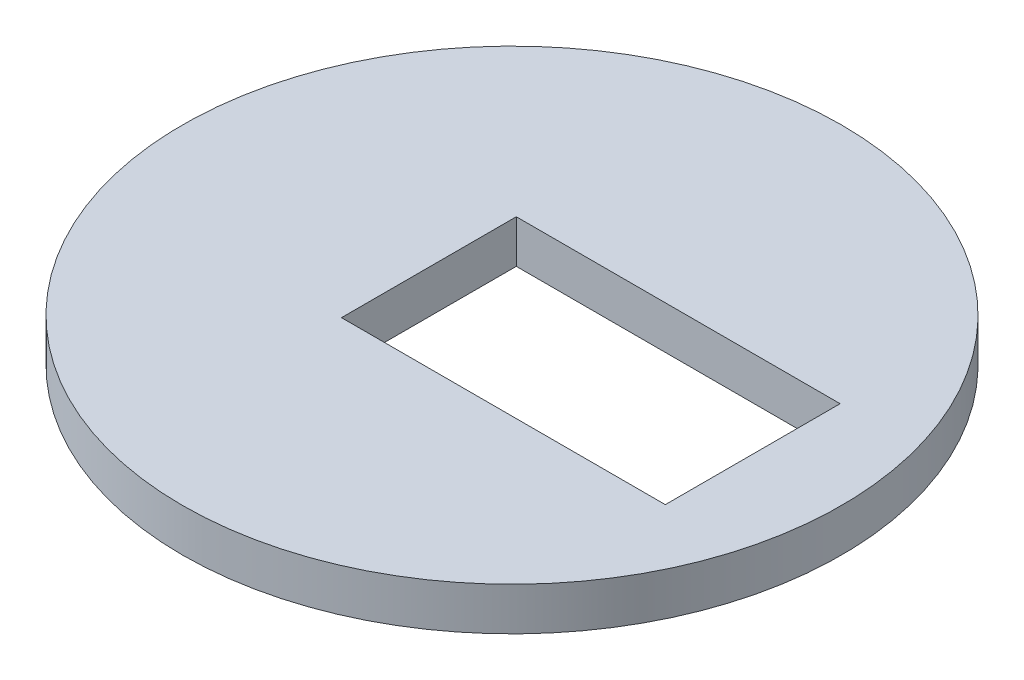
ISO-10303-21;
HEADER;
FILE_DESCRIPTION(('STEP AP214'),'2;1');
FILE_NAME('part.step','',(''),(''),'','','');
FILE_SCHEMA(('AUTOMOTIVE_DESIGN { 1 0 10303 214 1 1 1 1 }'));
ENDSEC;
DATA;
#1=APPLICATION_CONTEXT('core data for automotive mechanical design processes');
#2=APPLICATION_PROTOCOL_DEFINITION('international standard','automotive_design',2000,#1);
#3=PRODUCT_CONTEXT('',#1,'mechanical');
#4=PRODUCT('Part','Part','',(#3));
#5=PRODUCT_RELATED_PRODUCT_CATEGORY('part','',(#4));
#6=PRODUCT_DEFINITION_FORMATION('','',#4);
#7=PRODUCT_DEFINITION_CONTEXT('part definition',#1,'design');
#8=PRODUCT_DEFINITION('design','',#6,#7);
#9=PRODUCT_DEFINITION_SHAPE('','',#8);
#10=(LENGTH_UNIT() NAMED_UNIT(*) SI_UNIT(.MILLI.,.METRE.));
#11=(NAMED_UNIT(*) PLANE_ANGLE_UNIT() SI_UNIT($,.RADIAN.));
#12=(NAMED_UNIT(*) SI_UNIT($,.STERADIAN.) SOLID_ANGLE_UNIT());
#13=UNCERTAINTY_MEASURE_WITH_UNIT(LENGTH_MEASURE(1.E-05),#10,'distance_accuracy_value','');
#14=(GEOMETRIC_REPRESENTATION_CONTEXT(3) GLOBAL_UNCERTAINTY_ASSIGNED_CONTEXT((#13)) GLOBAL_UNIT_ASSIGNED_CONTEXT((#10,
#11,#12)) REPRESENTATION_CONTEXT('',''));
#15=CARTESIAN_POINT('',(0.,0.,0.));
#16=DIRECTION('',(0.,0.,1.));
#17=DIRECTION('',(1.,0.,0.));
#18=AXIS2_PLACEMENT_3D('',#15,#16,#17);
#19=CARTESIAN_POINT('',(0.,3.,0.));
#20=DIRECTION('',(0.,-1.,0.));
#21=DIRECTION('',(0.,0.,-1.));
#22=AXIS2_PLACEMENT_3D('',#19,#20,#21);
#23=CYLINDRICAL_SURFACE('',#22,23.);
#24=CARTESIAN_POINT('',(0.,3.,0.));
#25=DIRECTION('',(0.,1.,0.));
#26=DIRECTION('',(0.,0.,1.));
#27=AXIS2_PLACEMENT_3D('',#24,#25,#26);
#28=CIRCLE('',#27,23.);
#29=CARTESIAN_POINT('',(0.,3.,23.));
#30=VERTEX_POINT('',#29);
#31=EDGE_CURVE('E108',#30,#30,#28,.T.);
#32=ORIENTED_EDGE('',*,*,#31,.F.);
#33=EDGE_LOOP('',(#32));
#34=FACE_BOUND('',#33,.T.);
#35=CARTESIAN_POINT('',(0.,0.,0.));
#36=DIRECTION('',(0.,1.,0.));
#37=DIRECTION('',(0.,0.,1.));
#38=AXIS2_PLACEMENT_3D('',#35,#36,#37);
#39=CIRCLE('',#38,23.);
#40=CARTESIAN_POINT('',(0.,0.,23.));
#41=VERTEX_POINT('',#40);
#42=EDGE_CURVE('E105',#41,#41,#39,.T.);
#43=ORIENTED_EDGE('',*,*,#42,.T.);
#44=EDGE_LOOP('',(#43));
#45=FACE_BOUND('',#44,.T.);
#46=ADVANCED_FACE('F39',(#34,#45),#23,.T.);
#47=CARTESIAN_POINT('',(0.,3.,0.));
#48=DIRECTION('',(0.,1.,0.));
#49=DIRECTION('',(0.,0.,1.));
#50=AXIS2_PLACEMENT_3D('',#47,#48,#49);
#51=PLANE('',#50);
#52=DIRECTION('',(1.,0.,0.));
#53=VECTOR('',#52,1.);
#54=CARTESIAN_POINT('',(0.,3.,6.1));
#55=LINE('',#54,#53);
#56=CARTESIAN_POINT('',(-5.8,3.,6.1));
#57=VERTEX_POINT('',#56);
#58=CARTESIAN_POINT('',(16.8,3.,6.1));
#59=VERTEX_POINT('',#58);
#60=EDGE_CURVE('E53',#57,#59,#55,.T.);
#61=ORIENTED_EDGE('',*,*,#60,.F.);
#62=DIRECTION('',(0.,0.,-1.));
#63=VECTOR('',#62,1.);
#64=CARTESIAN_POINT('',(-5.8,3.,0.));
#65=LINE('',#64,#63);
#66=CARTESIAN_POINT('',(-5.8,3.,-6.1));
#67=VERTEX_POINT('',#66);
#68=EDGE_CURVE('E98',#57,#67,#65,.T.);
#69=ORIENTED_EDGE('',*,*,#68,.T.);
#70=DIRECTION('',(1.,0.,0.));
#71=VECTOR('',#70,1.);
#72=CARTESIAN_POINT('',(0.,3.,-6.1));
#73=LINE('',#72,#71);
#74=CARTESIAN_POINT('',(16.8,3.,-6.1));
#75=VERTEX_POINT('',#74);
#76=EDGE_CURVE('E82',#67,#75,#73,.T.);
#77=ORIENTED_EDGE('',*,*,#76,.T.);
#78=DIRECTION('',(0.,0.,-1.));
#79=VECTOR('',#78,1.);
#80=CARTESIAN_POINT('',(16.8,3.,0.));
#81=LINE('',#80,#79);
#82=EDGE_CURVE('E91',#59,#75,#81,.T.);
#83=ORIENTED_EDGE('',*,*,#82,.F.);
#84=EDGE_LOOP('',(#61,#69,#77,#83));
#85=FACE_BOUND('',#84,.T.);
#86=ORIENTED_EDGE('',*,*,#31,.T.);
#87=EDGE_LOOP('',(#86));
#88=FACE_BOUND('',#87,.T.);
#89=ADVANCED_FACE('F95',(#85,#88),#51,.T.);
#90=CARTESIAN_POINT('',(0.,0.,0.));
#91=DIRECTION('',(0.,1.,0.));
#92=DIRECTION('',(0.,0.,1.));
#93=AXIS2_PLACEMENT_3D('',#90,#91,#92);
#94=PLANE('',#93);
#95=DIRECTION('',(0.,0.,-1.));
#96=VECTOR('',#95,1.);
#97=CARTESIAN_POINT('',(-5.8,0.,0.));
#98=LINE('',#97,#96);
#99=CARTESIAN_POINT('',(-5.8,0.,6.1));
#100=VERTEX_POINT('',#99);
#101=CARTESIAN_POINT('',(-5.8,0.,-6.1));
#102=VERTEX_POINT('',#101);
#103=EDGE_CURVE('E46',#100,#102,#98,.T.);
#104=ORIENTED_EDGE('',*,*,#103,.F.);
#105=DIRECTION('',(1.,0.,0.));
#106=VECTOR('',#105,1.);
#107=CARTESIAN_POINT('',(0.,0.,6.1));
#108=LINE('',#107,#106);
#109=CARTESIAN_POINT('',(16.8,0.,6.1));
#110=VERTEX_POINT('',#109);
#111=EDGE_CURVE('E11',#100,#110,#108,.T.);
#112=ORIENTED_EDGE('',*,*,#111,.T.);
#113=DIRECTION('',(0.,0.,-1.));
#114=VECTOR('',#113,1.);
#115=CARTESIAN_POINT('',(16.8,0.,0.));
#116=LINE('',#115,#114);
#117=CARTESIAN_POINT('',(16.8,0.,-6.1));
#118=VERTEX_POINT('',#117);
#119=EDGE_CURVE('E111',#110,#118,#116,.T.);
#120=ORIENTED_EDGE('',*,*,#119,.T.);
#121=DIRECTION('',(1.,0.,0.));
#122=VECTOR('',#121,1.);
#123=CARTESIAN_POINT('',(0.,0.,-6.1));
#124=LINE('',#123,#122);
#125=EDGE_CURVE('E85',#102,#118,#124,.T.);
#126=ORIENTED_EDGE('',*,*,#125,.F.);
#127=EDGE_LOOP('',(#104,#112,#120,#126));
#128=FACE_BOUND('',#127,.T.);
#129=ORIENTED_EDGE('',*,*,#42,.F.);
#130=EDGE_LOOP('',(#129));
#131=FACE_BOUND('',#130,.T.);
#132=ADVANCED_FACE('F120',(#128,#131),#94,.F.);
#133=CARTESIAN_POINT('',(0.,-7.,6.1));
#134=DIRECTION('',(0.,0.,1.));
#135=DIRECTION('',(1.,0.,0.));
#136=AXIS2_PLACEMENT_3D('',#133,#134,#135);
#137=PLANE('',#136);
#138=DIRECTION('',(0.,1.,0.));
#139=VECTOR('',#138,1.);
#140=CARTESIAN_POINT('',(-5.8,-7.,6.1));
#141=LINE('',#140,#139);
#142=EDGE_CURVE('E103',#100,#57,#141,.T.);
#143=ORIENTED_EDGE('',*,*,#142,.T.);
#144=ORIENTED_EDGE('',*,*,#60,.T.);
#145=DIRECTION('',(0.,1.,0.));
#146=VECTOR('',#145,1.);
#147=CARTESIAN_POINT('',(16.8,-7.,6.1));
#148=LINE('',#147,#146);
#149=EDGE_CURVE('E88',#110,#59,#148,.T.);
#150=ORIENTED_EDGE('',*,*,#149,.F.);
#151=ORIENTED_EDGE('',*,*,#111,.F.);
#152=EDGE_LOOP('',(#143,#144,#150,#151));
#153=FACE_BOUND('',#152,.T.);
#154=ADVANCED_FACE('F122',(#153),#137,.F.);
#155=CARTESIAN_POINT('',(-5.8,-7.,0.));
#156=DIRECTION('',(1.,0.,0.));
#157=DIRECTION('',(0.,0.,-1.));
#158=AXIS2_PLACEMENT_3D('',#155,#156,#157);
#159=PLANE('',#158);
#160=ORIENTED_EDGE('',*,*,#103,.T.);
#161=DIRECTION('',(0.,1.,0.));
#162=VECTOR('',#161,1.);
#163=CARTESIAN_POINT('',(-5.8,-7.,-6.1));
#164=LINE('',#163,#162);
#165=EDGE_CURVE('E87',#102,#67,#164,.T.);
#166=ORIENTED_EDGE('',*,*,#165,.T.);
#167=ORIENTED_EDGE('',*,*,#68,.F.);
#168=ORIENTED_EDGE('',*,*,#142,.F.);
#169=EDGE_LOOP('',(#160,#166,#167,#168));
#170=FACE_BOUND('',#169,.T.);
#171=ADVANCED_FACE('F118',(#170),#159,.T.);
#172=CARTESIAN_POINT('',(0.,-7.,-6.1));
#173=DIRECTION('',(0.,0.,1.));
#174=DIRECTION('',(1.,0.,0.));
#175=AXIS2_PLACEMENT_3D('',#172,#173,#174);
#176=PLANE('',#175);
#177=ORIENTED_EDGE('',*,*,#125,.T.);
#178=DIRECTION('',(0.,1.,0.));
#179=VECTOR('',#178,1.);
#180=CARTESIAN_POINT('',(16.8,-7.,-6.1));
#181=LINE('',#180,#179);
#182=EDGE_CURVE('E61',#118,#75,#181,.T.);
#183=ORIENTED_EDGE('',*,*,#182,.T.);
#184=ORIENTED_EDGE('',*,*,#76,.F.);
#185=ORIENTED_EDGE('',*,*,#165,.F.);
#186=EDGE_LOOP('',(#177,#183,#184,#185));
#187=FACE_BOUND('',#186,.T.);
#188=ADVANCED_FACE('F79',(#187),#176,.T.);
#189=CARTESIAN_POINT('',(16.8,-7.,0.));
#190=DIRECTION('',(1.,0.,0.));
#191=DIRECTION('',(0.,0.,-1.));
#192=AXIS2_PLACEMENT_3D('',#189,#190,#191);
#193=PLANE('',#192);
#194=ORIENTED_EDGE('',*,*,#149,.T.);
#195=ORIENTED_EDGE('',*,*,#82,.T.);
#196=ORIENTED_EDGE('',*,*,#182,.F.);
#197=ORIENTED_EDGE('',*,*,#119,.F.);
#198=EDGE_LOOP('',(#194,#195,#196,#197));
#199=FACE_BOUND('',#198,.T.);
#200=ADVANCED_FACE('F92',(#199),#193,.F.);
#201=CLOSED_SHELL('',(#46,#89,#132,#154,#171,#188,#200));
#202=MANIFOLD_SOLID_BREP('B2',#201);
#203=ADVANCED_BREP_SHAPE_REPRESENTATION('',(#18,#202),#14);
#204=SHAPE_DEFINITION_REPRESENTATION(#9,#203);
ENDSEC;
END-ISO-10303-21;
